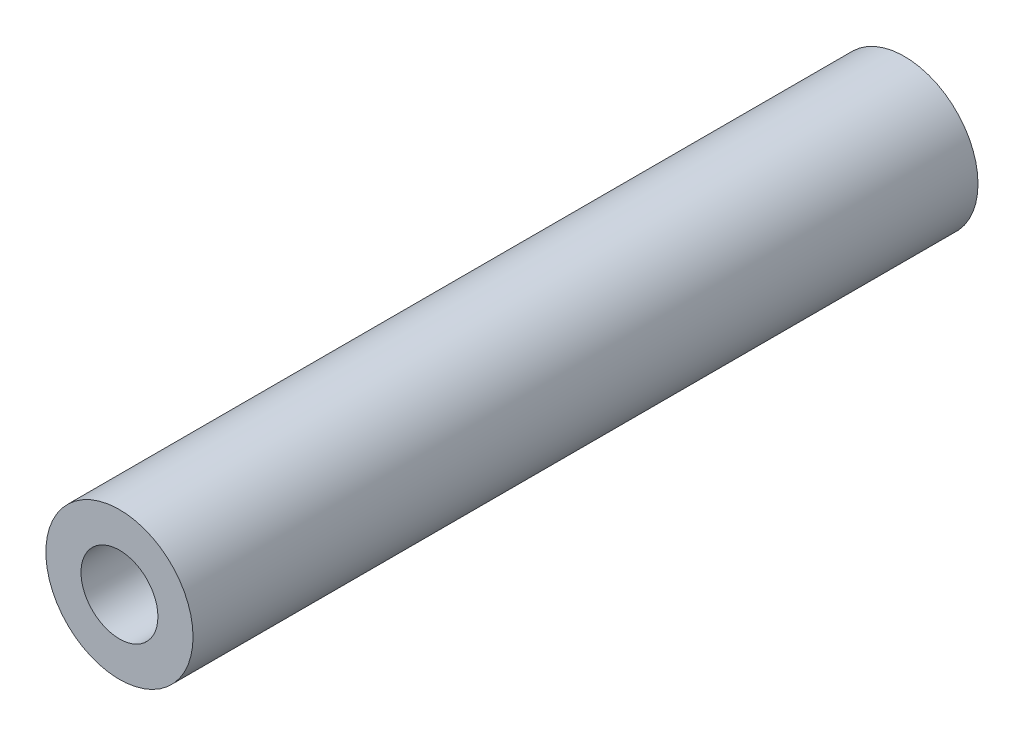
ISO-10303-21;
HEADER;
FILE_DESCRIPTION(('STEP AP214'),'2;1');
FILE_NAME('part.step','',(''),(''),'','','');
FILE_SCHEMA(('AUTOMOTIVE_DESIGN { 1 0 10303 214 1 1 1 1 }'));
ENDSEC;
DATA;
#1=APPLICATION_CONTEXT('core data for automotive mechanical design processes');
#2=APPLICATION_PROTOCOL_DEFINITION('international standard','automotive_design',2000,#1);
#3=PRODUCT_CONTEXT('',#1,'mechanical');
#4=PRODUCT('Part','Part','',(#3));
#5=PRODUCT_RELATED_PRODUCT_CATEGORY('part','',(#4));
#6=PRODUCT_DEFINITION_FORMATION('','',#4);
#7=PRODUCT_DEFINITION_CONTEXT('part definition',#1,'design');
#8=PRODUCT_DEFINITION('design','',#6,#7);
#9=PRODUCT_DEFINITION_SHAPE('','',#8);
#10=(LENGTH_UNIT() NAMED_UNIT(*) SI_UNIT(.MILLI.,.METRE.));
#11=(NAMED_UNIT(*) PLANE_ANGLE_UNIT() SI_UNIT($,.RADIAN.));
#12=(NAMED_UNIT(*) SI_UNIT($,.STERADIAN.) SOLID_ANGLE_UNIT());
#13=UNCERTAINTY_MEASURE_WITH_UNIT(LENGTH_MEASURE(1.E-05),#10,'distance_accuracy_value','');
#14=(GEOMETRIC_REPRESENTATION_CONTEXT(3) GLOBAL_UNCERTAINTY_ASSIGNED_CONTEXT((#13)) GLOBAL_UNIT_ASSIGNED_CONTEXT((#10,
#11,#12)) REPRESENTATION_CONTEXT('',''));
#15=CARTESIAN_POINT('',(0.,0.,0.));
#16=DIRECTION('',(0.,0.,1.));
#17=DIRECTION('',(1.,0.,0.));
#18=AXIS2_PLACEMENT_3D('',#15,#16,#17);
#19=CARTESIAN_POINT('',(0.,0.,50.8));
#20=DIRECTION('',(0.,0.,1.));
#21=DIRECTION('',(1.,0.,0.));
#22=AXIS2_PLACEMENT_3D('',#19,#20,#21);
#23=PLANE('',#22);
#24=CARTESIAN_POINT('',(0.,0.,50.8));
#25=DIRECTION('',(0.,0.,1.));
#26=DIRECTION('',(1.,0.,0.));
#27=AXIS2_PLACEMENT_3D('',#24,#25,#26);
#28=CIRCLE('',#27,4.7625);
#29=CARTESIAN_POINT('',(4.7625,0.,50.8));
#30=VERTEX_POINT('',#29);
#31=EDGE_CURVE('E10',#30,#30,#28,.T.);
#32=ORIENTED_EDGE('',*,*,#31,.T.);
#33=EDGE_LOOP('',(#32));
#34=FACE_BOUND('',#33,.T.);
#35=CARTESIAN_POINT('',(0.,0.,50.8));
#36=DIRECTION('',(0.,0.,1.));
#37=DIRECTION('',(1.,0.,0.));
#38=AXIS2_PLACEMENT_3D('',#35,#36,#37);
#39=CIRCLE('',#38,2.4892);
#40=CARTESIAN_POINT('',(2.4892,0.,50.8));
#41=VERTEX_POINT('',#40);
#42=EDGE_CURVE('E56',#41,#41,#39,.T.);
#43=ORIENTED_EDGE('',*,*,#42,.F.);
#44=EDGE_LOOP('',(#43));
#45=FACE_BOUND('',#44,.T.);
#46=ADVANCED_FACE('F43',(#34,#45),#23,.T.);
#47=CARTESIAN_POINT('',(0.,0.,0.));
#48=DIRECTION('',(0.,0.,1.));
#49=DIRECTION('',(1.,0.,0.));
#50=AXIS2_PLACEMENT_3D('',#47,#48,#49);
#51=PLANE('',#50);
#52=CARTESIAN_POINT('',(0.,0.,0.));
#53=DIRECTION('',(0.,0.,1.));
#54=DIRECTION('',(1.,0.,0.));
#55=AXIS2_PLACEMENT_3D('',#52,#53,#54);
#56=CIRCLE('',#55,4.7625);
#57=CARTESIAN_POINT('',(4.7625,0.,0.));
#58=VERTEX_POINT('',#57);
#59=EDGE_CURVE('E47',#58,#58,#56,.T.);
#60=ORIENTED_EDGE('',*,*,#59,.F.);
#61=EDGE_LOOP('',(#60));
#62=FACE_BOUND('',#61,.T.);
#63=CARTESIAN_POINT('',(0.,0.,0.));
#64=DIRECTION('',(0.,0.,1.));
#65=DIRECTION('',(1.,0.,0.));
#66=AXIS2_PLACEMENT_3D('',#63,#64,#65);
#67=CIRCLE('',#66,2.4892);
#68=CARTESIAN_POINT('',(2.4892,0.,0.));
#69=VERTEX_POINT('',#68);
#70=EDGE_CURVE('E58',#69,#69,#67,.T.);
#71=ORIENTED_EDGE('',*,*,#70,.T.);
#72=EDGE_LOOP('',(#71));
#73=FACE_BOUND('',#72,.T.);
#74=ADVANCED_FACE('F70',(#62,#73),#51,.F.);
#75=CARTESIAN_POINT('',(0.,0.,50.8));
#76=DIRECTION('',(0.,0.,-1.));
#77=DIRECTION('',(-1.,0.,0.));
#78=AXIS2_PLACEMENT_3D('',#75,#76,#77);
#79=CYLINDRICAL_SURFACE('',#78,4.7625);
#80=ORIENTED_EDGE('',*,*,#31,.F.);
#81=EDGE_LOOP('',(#80));
#82=FACE_BOUND('',#81,.T.);
#83=ORIENTED_EDGE('',*,*,#59,.T.);
#84=EDGE_LOOP('',(#83));
#85=FACE_BOUND('',#84,.T.);
#86=ADVANCED_FACE('F45',(#82,#85),#79,.T.);
#87=CARTESIAN_POINT('',(0.,0.,50.8));
#88=DIRECTION('',(0.,0.,-1.));
#89=DIRECTION('',(-1.,0.,0.));
#90=AXIS2_PLACEMENT_3D('',#87,#88,#89);
#91=CYLINDRICAL_SURFACE('',#90,2.4892);
#92=ORIENTED_EDGE('',*,*,#42,.T.);
#93=EDGE_LOOP('',(#92));
#94=FACE_BOUND('',#93,.T.);
#95=ORIENTED_EDGE('',*,*,#70,.F.);
#96=EDGE_LOOP('',(#95));
#97=FACE_BOUND('',#96,.T.);
#98=ADVANCED_FACE('F66',(#94,#97),#91,.F.);
#99=CLOSED_SHELL('',(#46,#74,#86,#98));
#100=MANIFOLD_SOLID_BREP('B2',#99);
#101=ADVANCED_BREP_SHAPE_REPRESENTATION('',(#18,#100),#14);
#102=SHAPE_DEFINITION_REPRESENTATION(#9,#101);
ENDSEC;
END-ISO-10303-21;
